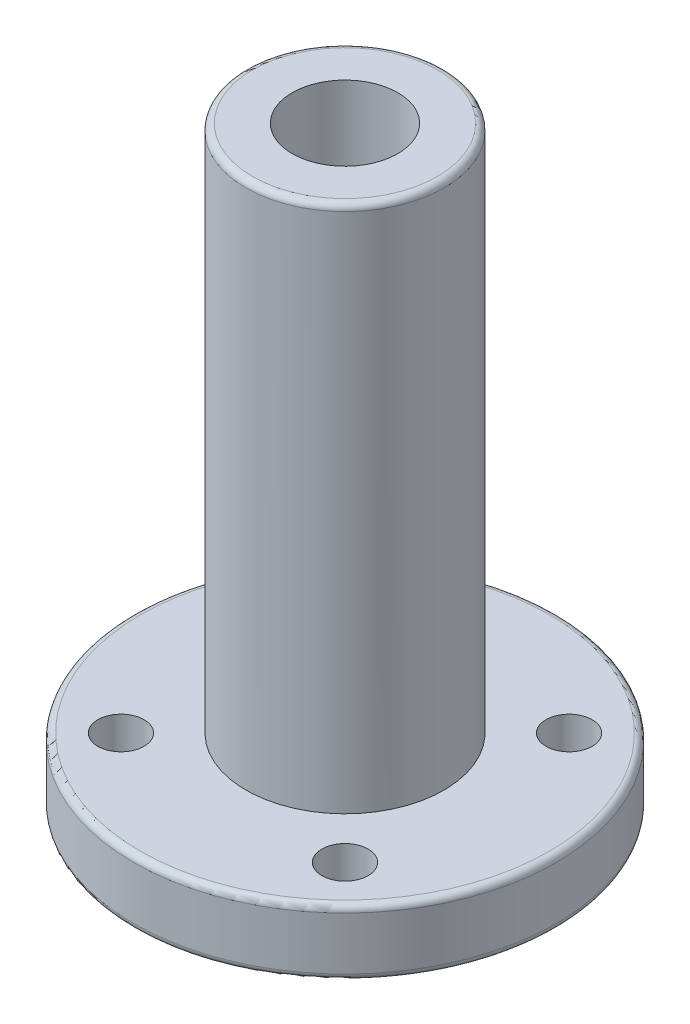
ISO-10303-21;
HEADER;
FILE_DESCRIPTION(('STEP AP214'),'2;1');
FILE_NAME('part.step','',(''),(''),'','','');
FILE_SCHEMA(('AUTOMOTIVE_DESIGN { 1 0 10303 214 1 1 1 1 }'));
ENDSEC;
DATA;
#1=APPLICATION_CONTEXT('core data for automotive mechanical design processes');
#2=APPLICATION_PROTOCOL_DEFINITION('international standard','automotive_design',2000,#1);
#3=PRODUCT_CONTEXT('',#1,'mechanical');
#4=PRODUCT('Part','Part','',(#3));
#5=PRODUCT_RELATED_PRODUCT_CATEGORY('part','',(#4));
#6=PRODUCT_DEFINITION_FORMATION('','',#4);
#7=PRODUCT_DEFINITION_CONTEXT('part definition',#1,'design');
#8=PRODUCT_DEFINITION('design','',#6,#7);
#9=PRODUCT_DEFINITION_SHAPE('','',#8);
#10=(LENGTH_UNIT() NAMED_UNIT(*) SI_UNIT(.MILLI.,.METRE.));
#11=(NAMED_UNIT(*) PLANE_ANGLE_UNIT() SI_UNIT($,.RADIAN.));
#12=(NAMED_UNIT(*) SI_UNIT($,.STERADIAN.) SOLID_ANGLE_UNIT());
#13=UNCERTAINTY_MEASURE_WITH_UNIT(LENGTH_MEASURE(1.E-05),#10,'distance_accuracy_value','');
#14=(GEOMETRIC_REPRESENTATION_CONTEXT(3) GLOBAL_UNCERTAINTY_ASSIGNED_CONTEXT((#13)) GLOBAL_UNIT_ASSIGNED_CONTEXT((#10,
#11,#12)) REPRESENTATION_CONTEXT('',''));
#15=CARTESIAN_POINT('',(0.,0.,0.));
#16=DIRECTION('',(0.,0.,1.));
#17=DIRECTION('',(1.,0.,0.));
#18=AXIS2_PLACEMENT_3D('',#15,#16,#17);
#19=CARTESIAN_POINT('',(0.,45.,0.));
#20=DIRECTION('',(0.,-1.,0.));
#21=DIRECTION('',(0.,0.,-1.));
#22=AXIS2_PLACEMENT_3D('',#19,#20,#21);
#23=CYLINDRICAL_SURFACE('',#22,7.5);
#24=CARTESIAN_POINT('',(0.,44.5,0.));
#25=DIRECTION('',(0.,1.,0.));
#26=DIRECTION('',(0.,0.,1.));
#27=AXIS2_PLACEMENT_3D('',#24,#25,#26);
#28=CIRCLE('',#27,7.5);
#29=CARTESIAN_POINT('',(0.,44.5,-7.5));
#30=VERTEX_POINT('',#29);
#31=EDGE_CURVE('E39',#30,#30,#28,.F.);
#32=CARTESIAN_POINT('',(0.,5.,0.));
#33=DIRECTION('',(0.,-1.,0.));
#34=DIRECTION('',(0.,0.,-1.));
#35=AXIS2_PLACEMENT_3D('',#32,#33,#34);
#36=CIRCLE('',#35,7.5);
#37=CARTESIAN_POINT('',(0.,5.,-7.5));
#38=VERTEX_POINT('',#37);
#39=EDGE_CURVE('E58',#38,#38,#36,.T.);
#40=CARTESIAN_POINT('',(0.,44.5,-7.5));
#41=CARTESIAN_POINT('',(0.,44.0885416666667,-7.5));
#42=CARTESIAN_POINT('',(0.,43.6770833333333,-7.5));
#43=CARTESIAN_POINT('',(0.,42.8541666666667,-7.5));
#44=CARTESIAN_POINT('',(0.,42.4427083333333,-7.5));
#45=CARTESIAN_POINT('',(0.,41.6197916666667,-7.5));
#46=CARTESIAN_POINT('',(0.,41.2083333333333,-7.5));
#47=CARTESIAN_POINT('',(0.,40.3854166666667,-7.5));
#48=CARTESIAN_POINT('',(0.,39.9739583333333,-7.5));
#49=CARTESIAN_POINT('',(0.,39.1510416666667,-7.5));
#50=CARTESIAN_POINT('',(0.,38.7395833333333,-7.5));
#51=CARTESIAN_POINT('',(0.,37.9166666666667,-7.5));
#52=CARTESIAN_POINT('',(0.,37.5052083333333,-7.5));
#53=CARTESIAN_POINT('',(0.,36.6822916666667,-7.5));
#54=CARTESIAN_POINT('',(0.,36.2708333333333,-7.5));
#55=CARTESIAN_POINT('',(0.,35.4479166666667,-7.5));
#56=CARTESIAN_POINT('',(0.,35.0364583333333,-7.5));
#57=CARTESIAN_POINT('',(0.,34.2135416666667,-7.5));
#58=CARTESIAN_POINT('',(0.,33.8020833333333,-7.5));
#59=CARTESIAN_POINT('',(0.,32.9791666666667,-7.5));
#60=CARTESIAN_POINT('',(0.,32.5677083333333,-7.5));
#61=CARTESIAN_POINT('',(0.,31.7447916666667,-7.5));
#62=CARTESIAN_POINT('',(0.,31.3333333333333,-7.5));
#63=CARTESIAN_POINT('',(0.,30.5104166666667,-7.5));
#64=CARTESIAN_POINT('',(0.,30.0989583333333,-7.5));
#65=CARTESIAN_POINT('',(0.,29.2760416666667,-7.5));
#66=CARTESIAN_POINT('',(0.,28.8645833333333,-7.5));
#67=CARTESIAN_POINT('',(0.,28.0416666666667,-7.5));
#68=CARTESIAN_POINT('',(0.,27.6302083333333,-7.5));
#69=CARTESIAN_POINT('',(0.,26.8072916666667,-7.5));
#70=CARTESIAN_POINT('',(0.,26.3958333333333,-7.5));
#71=CARTESIAN_POINT('',(0.,25.5729166666667,-7.5));
#72=CARTESIAN_POINT('',(0.,25.1614583333333,-7.5));
#73=CARTESIAN_POINT('',(0.,24.3385416666667,-7.5));
#74=CARTESIAN_POINT('',(0.,23.9270833333333,-7.5));
#75=CARTESIAN_POINT('',(0.,23.1041666666667,-7.5));
#76=CARTESIAN_POINT('',(0.,22.6927083333333,-7.5));
#77=CARTESIAN_POINT('',(0.,21.8697916666667,-7.5));
#78=CARTESIAN_POINT('',(0.,21.4583333333333,-7.5));
#79=CARTESIAN_POINT('',(0.,20.6354166666667,-7.5));
#80=CARTESIAN_POINT('',(0.,20.2239583333333,-7.5));
#81=CARTESIAN_POINT('',(0.,19.4010416666667,-7.5));
#82=CARTESIAN_POINT('',(0.,18.9895833333333,-7.5));
#83=CARTESIAN_POINT('',(0.,18.1666666666667,-7.5));
#84=CARTESIAN_POINT('',(0.,17.7552083333333,-7.5));
#85=CARTESIAN_POINT('',(0.,16.9322916666667,-7.5));
#86=CARTESIAN_POINT('',(0.,16.5208333333333,-7.5));
#87=CARTESIAN_POINT('',(0.,15.6979166666667,-7.5));
#88=CARTESIAN_POINT('',(0.,15.2864583333333,-7.5));
#89=CARTESIAN_POINT('',(0.,14.4635416666667,-7.5));
#90=CARTESIAN_POINT('',(0.,14.0520833333333,-7.5));
#91=CARTESIAN_POINT('',(0.,13.2291666666667,-7.5));
#92=CARTESIAN_POINT('',(0.,12.8177083333333,-7.5));
#93=CARTESIAN_POINT('',(0.,11.9947916666667,-7.5));
#94=CARTESIAN_POINT('',(0.,11.5833333333333,-7.5));
#95=CARTESIAN_POINT('',(0.,10.7604166666667,-7.5));
#96=CARTESIAN_POINT('',(0.,10.3489583333333,-7.5));
#97=CARTESIAN_POINT('',(0.,9.52604166666666,-7.5));
#98=CARTESIAN_POINT('',(0.,9.11458333333333,-7.5));
#99=CARTESIAN_POINT('',(0.,8.29166666666666,-7.5));
#100=CARTESIAN_POINT('',(0.,7.88020833333333,-7.5));
#101=CARTESIAN_POINT('',(0.,7.05729166666666,-7.5));
#102=CARTESIAN_POINT('',(0.,6.64583333333333,-7.5));
#103=CARTESIAN_POINT('',(0.,5.82291666666667,-7.5));
#104=CARTESIAN_POINT('',(0.,5.41145833333333,-7.5));
#105=CARTESIAN_POINT('',(0.,5.,-7.5));
#106=B_SPLINE_CURVE_WITH_KNOTS('',3,(#40,#41,#42,#43,#44,#45,#46,#47,#48,#49,#50,#51,#52,#53,
#54,#55,#56,#57,#58,#59,#60,#61,#62,#63,#64,#65,#66,#67,#68,#69,#70,#71,#72,#73,#74,#75,#76,#77,
#78,#79,#80,#81,#82,#83,#84,#85,#86,#87,#88,#89,#90,#91,#92,#93,#94,#95,#96,#97,#98,#99,#100,
#101,#102,#103,#104,#105),.UNSPECIFIED.,.F.,.F.,(4,2,2,2,2,2,2,2,2,2,2,2,2,2,2,2,2,2,2,2,2,2,2,
2,2,2,2,2,2,2,2,2,4),(0.,1.234375,2.46875,3.70312499999999,4.9375,6.17187499999999,7.40625,
8.64062499999999,9.87499999999999,11.109375,12.34375,13.578125,14.8125,16.046875,17.28125,
18.515625,19.75,20.984375,22.21875,23.453125,24.6875,25.921875,27.15625,28.390625,29.625,
30.859375,32.09375,33.328125,34.5625,35.796875,37.03125,38.265625,39.5),.UNSPECIFIED.);
#107=EDGE_CURVE('BSEAM32',#30,#38,#106,.T.);
#108=ORIENTED_EDGE('',*,*,#31,.T.);
#109=ORIENTED_EDGE('',*,*,#39,.F.);
#110=ORIENTED_EDGE('',*,*,#107,.T.);
#111=ORIENTED_EDGE('',*,*,#107,.F.);
#112=EDGE_LOOP('',(#108,#110,#109,#111));
#113=FACE_BOUND('',#112,.T.);
#114=ADVANCED_FACE('F32',(#113),#23,.T.);
#115=CARTESIAN_POINT('',(0.,45.,0.));
#116=DIRECTION('',(0.,1.,0.));
#117=DIRECTION('',(0.,0.,1.));
#118=AXIS2_PLACEMENT_3D('',#115,#116,#117);
#119=PLANE('',#118);
#120=CARTESIAN_POINT('',(0.,45.,0.));
#121=DIRECTION('',(0.,1.,0.));
#122=DIRECTION('',(0.,0.,1.));
#123=AXIS2_PLACEMENT_3D('',#120,#121,#122);
#124=CIRCLE('',#123,7.);
#125=CARTESIAN_POINT('',(0.,45.,7.));
#126=VERTEX_POINT('',#125);
#127=EDGE_CURVE('E43',#126,#126,#124,.T.);
#128=ORIENTED_EDGE('',*,*,#127,.T.);
#129=EDGE_LOOP('',(#128));
#130=FACE_BOUND('',#129,.T.);
#131=CARTESIAN_POINT('',(0.,45.,0.));
#132=DIRECTION('',(0.,1.,0.));
#133=DIRECTION('',(0.,0.,1.));
#134=AXIS2_PLACEMENT_3D('',#131,#132,#133);
#135=CIRCLE('',#134,4.);
#136=CARTESIAN_POINT('',(0.,45.,-4.));
#137=VERTEX_POINT('',#136);
#138=EDGE_CURVE('E61',#137,#137,#135,.T.);
#139=ORIENTED_EDGE('',*,*,#138,.F.);
#140=EDGE_LOOP('',(#139));
#141=FACE_BOUND('',#140,.T.);
#142=ADVANCED_FACE('F107',(#130,#141),#119,.T.);
#143=CARTESIAN_POINT('',(0.,0.,0.));
#144=DIRECTION('',(0.,1.,0.));
#145=DIRECTION('',(0.,0.,1.));
#146=AXIS2_PLACEMENT_3D('',#143,#144,#145);
#147=PLANE('',#146);
#148=CARTESIAN_POINT('',(0.,0.,0.));
#149=DIRECTION('',(0.,1.,0.));
#150=DIRECTION('',(0.,0.,1.));
#151=AXIS2_PLACEMENT_3D('',#148,#149,#150);
#152=CIRCLE('',#151,15.5);
#153=CARTESIAN_POINT('',(0.,0.,15.5));
#154=VERTEX_POINT('',#153);
#155=EDGE_CURVE('E55',#154,#154,#152,.F.);
#156=ORIENTED_EDGE('',*,*,#155,.T.);
#157=EDGE_LOOP('',(#156));
#158=FACE_BOUND('',#157,.T.);
#159=CARTESIAN_POINT('',(0.,0.,0.));
#160=DIRECTION('',(0.,1.,0.));
#161=DIRECTION('',(0.,0.,1.));
#162=AXIS2_PLACEMENT_3D('',#159,#160,#161);
#163=CIRCLE('',#162,4.);
#164=CARTESIAN_POINT('',(0.,0.,-4.));
#165=VERTEX_POINT('',#164);
#166=EDGE_CURVE('E62',#165,#165,#163,.T.);
#167=ORIENTED_EDGE('',*,*,#166,.T.);
#168=EDGE_LOOP('',(#167));
#169=FACE_BOUND('',#168,.T.);
#170=CARTESIAN_POINT('',(8.48528137423855,0.,-8.48528137423859));
#171=DIRECTION('',(0.,-1.,0.));
#172=DIRECTION('',(0.,0.,1.));
#173=AXIS2_PLACEMENT_3D('',#170,#171,#172);
#174=CIRCLE('',#173,1.75);
#175=CARTESIAN_POINT('',(8.48528137423855,0.,-6.73528137423859));
#176=VERTEX_POINT('',#175);
#177=EDGE_CURVE('E86',#176,#176,#174,.T.);
#178=ORIENTED_EDGE('',*,*,#177,.F.);
#179=EDGE_LOOP('',(#178));
#180=FACE_BOUND('',#179,.T.);
#181=CARTESIAN_POINT('',(-8.48528137423855,0.,-8.48528137423859));
#182=DIRECTION('',(0.,-1.,0.));
#183=DIRECTION('',(0.,0.,-1.));
#184=AXIS2_PLACEMENT_3D('',#181,#182,#183);
#185=CIRCLE('',#184,1.75);
#186=CARTESIAN_POINT('',(-8.48528137423855,0.,-10.2352813742386));
#187=VERTEX_POINT('',#186);
#188=EDGE_CURVE('E80',#187,#187,#185,.T.);
#189=ORIENTED_EDGE('',*,*,#188,.F.);
#190=EDGE_LOOP('',(#189));
#191=FACE_BOUND('',#190,.T.);
#192=CARTESIAN_POINT('',(-8.48528137423855,0.,8.48528137423859));
#193=DIRECTION('',(0.,-1.,0.));
#194=DIRECTION('',(0.,0.,1.));
#195=AXIS2_PLACEMENT_3D('',#192,#193,#194);
#196=CIRCLE('',#195,1.75);
#197=CARTESIAN_POINT('',(-8.48528137423855,0.,10.2352813742386));
#198=VERTEX_POINT('',#197);
#199=EDGE_CURVE('E74',#198,#198,#196,.T.);
#200=ORIENTED_EDGE('',*,*,#199,.F.);
#201=EDGE_LOOP('',(#200));
#202=FACE_BOUND('',#201,.T.);
#203=CARTESIAN_POINT('',(8.48528137423855,0.,8.48528137423859));
#204=DIRECTION('',(0.,-1.,0.));
#205=DIRECTION('',(0.,0.,-1.));
#206=AXIS2_PLACEMENT_3D('',#203,#204,#205);
#207=CIRCLE('',#206,1.75);
#208=CARTESIAN_POINT('',(8.48528137423855,0.,6.73528137423859));
#209=VERTEX_POINT('',#208);
#210=EDGE_CURVE('E68',#209,#209,#207,.T.);
#211=ORIENTED_EDGE('',*,*,#210,.F.);
#212=EDGE_LOOP('',(#211));
#213=FACE_BOUND('',#212,.T.);
#214=ADVANCED_FACE('F103',(#158,#169,#180,#191,#202,#213),#147,.F.);
#215=CARTESIAN_POINT('',(0.,45.,0.));
#216=DIRECTION('',(0.,-1.,0.));
#217=DIRECTION('',(0.,0.,-1.));
#218=AXIS2_PLACEMENT_3D('',#215,#216,#217);
#219=CYLINDRICAL_SURFACE('',#218,4.);
#220=CARTESIAN_POINT('',(0.,45.,-4.));
#221=CARTESIAN_POINT('',(0.,44.53125,-4.));
#222=CARTESIAN_POINT('',(0.,44.0625,-4.));
#223=CARTESIAN_POINT('',(0.,43.125,-4.));
#224=CARTESIAN_POINT('',(0.,42.65625,-4.));
#225=CARTESIAN_POINT('',(0.,41.71875,-4.));
#226=CARTESIAN_POINT('',(0.,41.25,-4.));
#227=CARTESIAN_POINT('',(0.,40.3125,-4.));
#228=CARTESIAN_POINT('',(0.,39.84375,-4.));
#229=CARTESIAN_POINT('',(0.,38.90625,-4.));
#230=CARTESIAN_POINT('',(0.,38.4375,-4.));
#231=CARTESIAN_POINT('',(0.,37.5,-4.));
#232=CARTESIAN_POINT('',(0.,37.03125,-4.));
#233=CARTESIAN_POINT('',(0.,36.09375,-4.));
#234=CARTESIAN_POINT('',(0.,35.625,-4.));
#235=CARTESIAN_POINT('',(0.,34.6875,-4.));
#236=CARTESIAN_POINT('',(0.,34.21875,-4.));
#237=CARTESIAN_POINT('',(0.,33.28125,-4.));
#238=CARTESIAN_POINT('',(0.,32.8125,-4.));
#239=CARTESIAN_POINT('',(0.,31.875,-4.));
#240=CARTESIAN_POINT('',(0.,31.40625,-4.));
#241=CARTESIAN_POINT('',(0.,30.46875,-4.));
#242=CARTESIAN_POINT('',(0.,30.,-4.));
#243=CARTESIAN_POINT('',(0.,29.0625,-4.));
#244=CARTESIAN_POINT('',(0.,28.59375,-4.));
#245=CARTESIAN_POINT('',(0.,27.65625,-4.));
#246=CARTESIAN_POINT('',(0.,27.1875,-4.));
#247=CARTESIAN_POINT('',(0.,26.25,-4.));
#248=CARTESIAN_POINT('',(0.,25.78125,-4.));
#249=CARTESIAN_POINT('',(0.,24.84375,-4.));
#250=CARTESIAN_POINT('',(0.,24.375,-4.));
#251=CARTESIAN_POINT('',(0.,23.4375,-4.));
#252=CARTESIAN_POINT('',(0.,22.96875,-4.));
#253=CARTESIAN_POINT('',(0.,22.03125,-4.));
#254=CARTESIAN_POINT('',(0.,21.5625,-4.));
#255=CARTESIAN_POINT('',(0.,20.625,-4.));
#256=CARTESIAN_POINT('',(0.,20.15625,-4.));
#257=CARTESIAN_POINT('',(0.,19.21875,-4.));
#258=CARTESIAN_POINT('',(0.,18.75,-4.));
#259=CARTESIAN_POINT('',(0.,17.8125,-4.));
#260=CARTESIAN_POINT('',(0.,17.34375,-4.));
#261=CARTESIAN_POINT('',(0.,16.40625,-4.));
#262=CARTESIAN_POINT('',(0.,15.9375,-4.));
#263=CARTESIAN_POINT('',(0.,15.,-4.));
#264=CARTESIAN_POINT('',(0.,14.53125,-4.));
#265=CARTESIAN_POINT('',(0.,13.59375,-4.));
#266=CARTESIAN_POINT('',(0.,13.125,-4.));
#267=CARTESIAN_POINT('',(0.,12.1875,-4.));
#268=CARTESIAN_POINT('',(0.,11.71875,-4.));
#269=CARTESIAN_POINT('',(0.,10.78125,-4.));
#270=CARTESIAN_POINT('',(0.,10.3125,-4.));
#271=CARTESIAN_POINT('',(0.,9.37499999999999,-4.));
#272=CARTESIAN_POINT('',(0.,8.90624999999999,-4.));
#273=CARTESIAN_POINT('',(0.,7.96874999999999,-4.));
#274=CARTESIAN_POINT('',(0.,7.5,-4.));
#275=CARTESIAN_POINT('',(0.,6.56249999999999,-4.));
#276=CARTESIAN_POINT('',(0.,6.09374999999999,-4.));
#277=CARTESIAN_POINT('',(0.,5.15624999999999,-4.));
#278=CARTESIAN_POINT('',(0.,4.68749999999999,-4.));
#279=CARTESIAN_POINT('',(0.,3.74999999999999,-4.));
#280=CARTESIAN_POINT('',(0.,3.28124999999999,-4.));
#281=CARTESIAN_POINT('',(0.,2.34374999999999,-4.));
#282=CARTESIAN_POINT('',(0.,1.87499999999999,-4.));
#283=CARTESIAN_POINT('',(0.,0.937499999999992,-4.));
#284=CARTESIAN_POINT('',(0.,0.468749999999993,-4.));
#285=CARTESIAN_POINT('',(0.,0.,-4.));
#286=B_SPLINE_CURVE_WITH_KNOTS('',3,(#220,#221,#222,#223,#224,#225,#226,#227,#228,#229,#230,
#231,#232,#233,#234,#235,#236,#237,#238,#239,#240,#241,#242,#243,#244,#245,#246,#247,#248,#249,
#250,#251,#252,#253,#254,#255,#256,#257,#258,#259,#260,#261,#262,#263,#264,#265,#266,#267,#268,
#269,#270,#271,#272,#273,#274,#275,#276,#277,#278,#279,#280,#281,#282,#283,#284,#285),
.UNSPECIFIED.,.F.,.F.,(4,2,2,2,2,2,2,2,2,2,2,2,2,2,2,2,2,2,2,2,2,2,2,2,2,2,2,2,2,2,2,2,4),(0.,
1.40625,2.8125,4.21874999999999,5.625,7.03125,8.43749999999999,9.84375,11.25,12.65625,14.0625,
15.46875,16.875,18.28125,19.6875,21.09375,22.5,23.90625,25.3125,26.71875,28.125,29.53125,
30.9375,32.34375,33.75,35.15625,36.5625,37.96875,39.375,40.78125,42.1875,43.59375,45.),.UNSPECIFIED.);
#287=EDGE_CURVE('BSEAM106',#137,#165,#286,.T.);
#288=ORIENTED_EDGE('',*,*,#138,.T.);
#289=ORIENTED_EDGE('',*,*,#166,.F.);
#290=ORIENTED_EDGE('',*,*,#287,.T.);
#291=ORIENTED_EDGE('',*,*,#287,.F.);
#292=EDGE_LOOP('',(#288,#290,#289,#291));
#293=FACE_BOUND('',#292,.T.);
#294=ADVANCED_FACE('F106',(#293),#219,.F.);
#295=CARTESIAN_POINT('',(0.,5.,0.));
#296=DIRECTION('',(0.,-1.,0.));
#297=DIRECTION('',(0.,0.,-1.));
#298=AXIS2_PLACEMENT_3D('',#295,#296,#297);
#299=CYLINDRICAL_SURFACE('',#298,16.);
#300=CARTESIAN_POINT('',(0.,0.5,0.));
#301=DIRECTION('',(0.,1.,0.));
#302=DIRECTION('',(0.,0.,1.));
#303=AXIS2_PLACEMENT_3D('',#300,#301,#302);
#304=CIRCLE('',#303,16.);
#305=CARTESIAN_POINT('',(0.,0.5,16.));
#306=VERTEX_POINT('',#305);
#307=EDGE_CURVE('E47',#306,#306,#304,.T.);
#308=ORIENTED_EDGE('',*,*,#307,.T.);
#309=EDGE_LOOP('',(#308));
#310=FACE_BOUND('',#309,.T.);
#311=CARTESIAN_POINT('',(0.,4.5,0.));
#312=DIRECTION('',(0.,-1.,0.));
#313=DIRECTION('',(0.,0.,-1.));
#314=AXIS2_PLACEMENT_3D('',#311,#312,#313);
#315=CIRCLE('',#314,16.);
#316=CARTESIAN_POINT('',(0.,4.5,-16.));
#317=VERTEX_POINT('',#316);
#318=EDGE_CURVE('E52',#317,#317,#315,.T.);
#319=ORIENTED_EDGE('',*,*,#318,.T.);
#320=EDGE_LOOP('',(#319));
#321=FACE_BOUND('',#320,.T.);
#322=ADVANCED_FACE('F127',(#310,#321),#299,.T.);
#323=CARTESIAN_POINT('',(0.,5.,0.));
#324=DIRECTION('',(0.,-1.,0.));
#325=DIRECTION('',(0.,0.,-1.));
#326=AXIS2_PLACEMENT_3D('',#323,#324,#325);
#327=PLANE('',#326);
#328=CARTESIAN_POINT('',(0.,5.,0.));
#329=DIRECTION('',(0.,-1.,0.));
#330=DIRECTION('',(0.,0.,-1.));
#331=AXIS2_PLACEMENT_3D('',#328,#329,#330);
#332=CIRCLE('',#331,15.5);
#333=CARTESIAN_POINT('',(0.,5.,-15.5));
#334=VERTEX_POINT('',#333);
#335=EDGE_CURVE('E10',#334,#334,#332,.F.);
#336=ORIENTED_EDGE('',*,*,#335,.T.);
#337=EDGE_LOOP('',(#336));
#338=FACE_BOUND('',#337,.T.);
#339=CARTESIAN_POINT('',(8.48528137423855,5.,-8.48528137423859));
#340=DIRECTION('',(0.,-1.,0.));
#341=DIRECTION('',(0.,0.,1.));
#342=AXIS2_PLACEMENT_3D('',#339,#340,#341);
#343=CIRCLE('',#342,1.75);
#344=CARTESIAN_POINT('',(8.48528137423855,5.,-6.73528137423859));
#345=VERTEX_POINT('',#344);
#346=EDGE_CURVE('E83',#345,#345,#343,.T.);
#347=ORIENTED_EDGE('',*,*,#346,.T.);
#348=EDGE_LOOP('',(#347));
#349=FACE_BOUND('',#348,.T.);
#350=CARTESIAN_POINT('',(-8.48528137423855,5.,-8.48528137423859));
#351=DIRECTION('',(0.,-1.,0.));
#352=DIRECTION('',(0.,0.,-1.));
#353=AXIS2_PLACEMENT_3D('',#350,#351,#352);
#354=CIRCLE('',#353,1.75);
#355=CARTESIAN_POINT('',(-8.48528137423855,5.,-10.2352813742386));
#356=VERTEX_POINT('',#355);
#357=EDGE_CURVE('E77',#356,#356,#354,.T.);
#358=ORIENTED_EDGE('',*,*,#357,.T.);
#359=EDGE_LOOP('',(#358));
#360=FACE_BOUND('',#359,.T.);
#361=CARTESIAN_POINT('',(-8.48528137423855,5.,8.48528137423859));
#362=DIRECTION('',(0.,-1.,0.));
#363=DIRECTION('',(0.,0.,1.));
#364=AXIS2_PLACEMENT_3D('',#361,#362,#363);
#365=CIRCLE('',#364,1.75);
#366=CARTESIAN_POINT('',(-8.48528137423855,5.,10.2352813742386));
#367=VERTEX_POINT('',#366);
#368=EDGE_CURVE('E71',#367,#367,#365,.T.);
#369=ORIENTED_EDGE('',*,*,#368,.T.);
#370=EDGE_LOOP('',(#369));
#371=FACE_BOUND('',#370,.T.);
#372=CARTESIAN_POINT('',(8.48528137423855,5.,8.48528137423859));
#373=DIRECTION('',(0.,-1.,0.));
#374=DIRECTION('',(0.,0.,-1.));
#375=AXIS2_PLACEMENT_3D('',#372,#373,#374);
#376=CIRCLE('',#375,1.75);
#377=CARTESIAN_POINT('',(8.48528137423855,5.,6.73528137423859));
#378=VERTEX_POINT('',#377);
#379=EDGE_CURVE('E65',#378,#378,#376,.T.);
#380=ORIENTED_EDGE('',*,*,#379,.T.);
#381=EDGE_LOOP('',(#380));
#382=FACE_BOUND('',#381,.T.);
#383=ORIENTED_EDGE('',*,*,#39,.T.);
#384=EDGE_LOOP('',(#383));
#385=FACE_BOUND('',#384,.T.);
#386=ADVANCED_FACE('F92',(#338,#349,#360,#371,#382,#385),#327,.F.);
#387=CARTESIAN_POINT('',(8.48528137423855,5.,8.48528137423859));
#388=DIRECTION('',(0.,-1.,0.));
#389=DIRECTION('',(0.,0.,-1.));
#390=AXIS2_PLACEMENT_3D('',#387,#388,#389);
#391=CYLINDRICAL_SURFACE('',#390,1.75);
#392=ORIENTED_EDGE('',*,*,#379,.F.);
#393=EDGE_LOOP('',(#392));
#394=FACE_BOUND('',#393,.T.);
#395=ORIENTED_EDGE('',*,*,#210,.T.);
#396=EDGE_LOOP('',(#395));
#397=FACE_BOUND('',#396,.T.);
#398=ADVANCED_FACE('F116',(#394,#397),#391,.F.);
#399=CARTESIAN_POINT('',(-8.48528137423855,5.,8.48528137423859));
#400=DIRECTION('',(0.,-1.,0.));
#401=DIRECTION('',(0.,0.,-1.));
#402=AXIS2_PLACEMENT_3D('',#399,#400,#401);
#403=CYLINDRICAL_SURFACE('',#402,1.75);
#404=ORIENTED_EDGE('',*,*,#368,.F.);
#405=EDGE_LOOP('',(#404));
#406=FACE_BOUND('',#405,.T.);
#407=ORIENTED_EDGE('',*,*,#199,.T.);
#408=EDGE_LOOP('',(#407));
#409=FACE_BOUND('',#408,.T.);
#410=ADVANCED_FACE('F118',(#406,#409),#403,.F.);
#411=CARTESIAN_POINT('',(-8.48528137423855,5.,-8.48528137423859));
#412=DIRECTION('',(0.,-1.,0.));
#413=DIRECTION('',(0.,0.,-1.));
#414=AXIS2_PLACEMENT_3D('',#411,#412,#413);
#415=CYLINDRICAL_SURFACE('',#414,1.75);
#416=ORIENTED_EDGE('',*,*,#357,.F.);
#417=EDGE_LOOP('',(#416));
#418=FACE_BOUND('',#417,.T.);
#419=ORIENTED_EDGE('',*,*,#188,.T.);
#420=EDGE_LOOP('',(#419));
#421=FACE_BOUND('',#420,.T.);
#422=ADVANCED_FACE('F99',(#418,#421),#415,.F.);
#423=CARTESIAN_POINT('',(8.48528137423855,5.,-8.48528137423859));
#424=DIRECTION('',(0.,-1.,0.));
#425=DIRECTION('',(0.,0.,-1.));
#426=AXIS2_PLACEMENT_3D('',#423,#424,#425);
#427=CYLINDRICAL_SURFACE('',#426,1.75);
#428=ORIENTED_EDGE('',*,*,#346,.F.);
#429=EDGE_LOOP('',(#428));
#430=FACE_BOUND('',#429,.T.);
#431=ORIENTED_EDGE('',*,*,#177,.T.);
#432=EDGE_LOOP('',(#431));
#433=FACE_BOUND('',#432,.T.);
#434=ADVANCED_FACE('F95',(#430,#433),#427,.F.);
#435=CARTESIAN_POINT('',(0.,0.5,0.));
#436=DIRECTION('',(0.,1.,0.));
#437=DIRECTION('',(0.,0.,1.));
#438=AXIS2_PLACEMENT_3D('',#435,#436,#437);
#439=TOROIDAL_SURFACE('',#438,15.5,0.5);
#440=ORIENTED_EDGE('',*,*,#307,.F.);
#441=EDGE_LOOP('',(#440));
#442=FACE_BOUND('',#441,.T.);
#443=ORIENTED_EDGE('',*,*,#155,.F.);
#444=EDGE_LOOP('',(#443));
#445=FACE_BOUND('',#444,.T.);
#446=ADVANCED_FACE('F98',(#442,#445),#439,.T.);
#447=CARTESIAN_POINT('',(0.,44.5,0.));
#448=DIRECTION('',(0.,1.,0.));
#449=DIRECTION('',(0.,0.,1.));
#450=AXIS2_PLACEMENT_3D('',#447,#448,#449);
#451=TOROIDAL_SURFACE('',#450,7.,0.5);
#452=ORIENTED_EDGE('',*,*,#31,.F.);
#453=EDGE_LOOP('',(#452));
#454=FACE_BOUND('',#453,.T.);
#455=ORIENTED_EDGE('',*,*,#127,.F.);
#456=EDGE_LOOP('',(#455));
#457=FACE_BOUND('',#456,.T.);
#458=ADVANCED_FACE('F140',(#454,#457),#451,.T.);
#459=CARTESIAN_POINT('',(0.,4.5,0.));
#460=DIRECTION('',(0.,-1.,0.));
#461=DIRECTION('',(0.,0.,-1.));
#462=AXIS2_PLACEMENT_3D('',#459,#460,#461);
#463=TOROIDAL_SURFACE('',#462,15.5,0.5);
#464=ORIENTED_EDGE('',*,*,#335,.F.);
#465=EDGE_LOOP('',(#464));
#466=FACE_BOUND('',#465,.T.);
#467=ORIENTED_EDGE('',*,*,#318,.F.);
#468=EDGE_LOOP('',(#467));
#469=FACE_BOUND('',#468,.T.);
#470=ADVANCED_FACE('F34',(#466,#469),#463,.T.);
#471=CLOSED_SHELL('',(#114,#142,#214,#294,#322,#386,#398,#410,#422,#434,#446,#458,#470));
#472=MANIFOLD_SOLID_BREP('B2',#471);
#473=ADVANCED_BREP_SHAPE_REPRESENTATION('',(#18,#472),#14);
#474=SHAPE_DEFINITION_REPRESENTATION(#9,#473);
ENDSEC;
END-ISO-10303-21;
